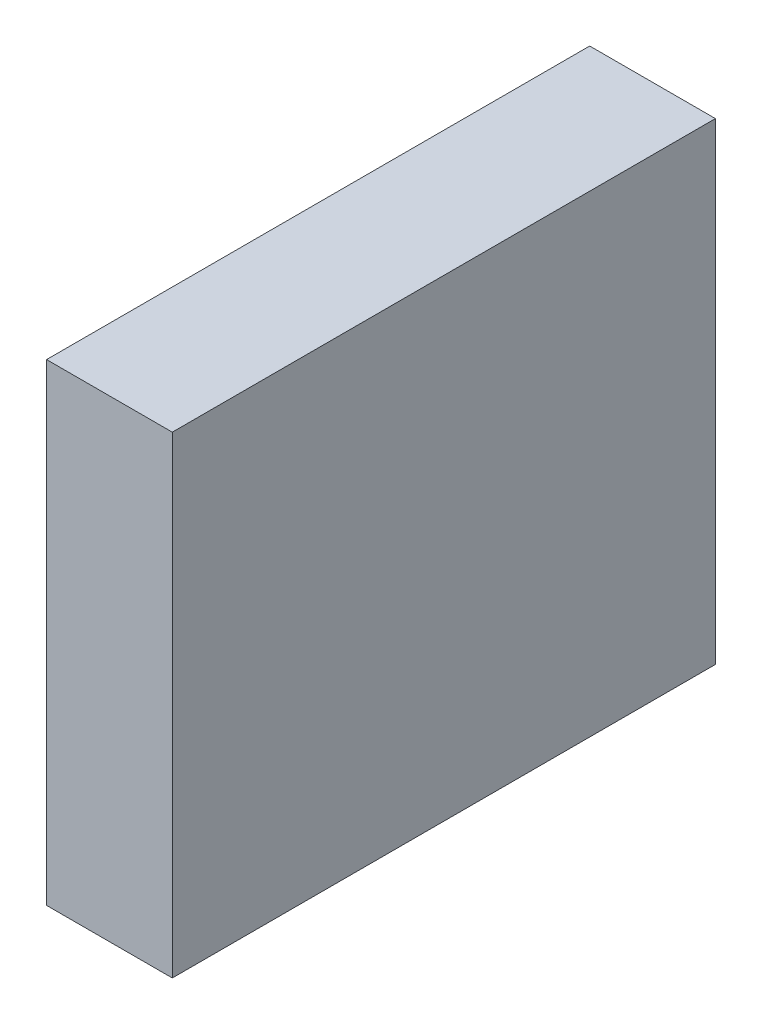
ISO-10303-21;
HEADER;
FILE_DESCRIPTION(('STEP AP214'),'2;1');
FILE_NAME('part.step','',(''),(''),'','','');
FILE_SCHEMA(('AUTOMOTIVE_DESIGN { 1 0 10303 214 1 1 1 1 }'));
ENDSEC;
DATA;
#1=APPLICATION_CONTEXT('core data for automotive mechanical design processes');
#2=APPLICATION_PROTOCOL_DEFINITION('international standard','automotive_design',2000,#1);
#3=PRODUCT_CONTEXT('',#1,'mechanical');
#4=PRODUCT('Part','Part','',(#3));
#5=PRODUCT_RELATED_PRODUCT_CATEGORY('part','',(#4));
#6=PRODUCT_DEFINITION_FORMATION('','',#4);
#7=PRODUCT_DEFINITION_CONTEXT('part definition',#1,'design');
#8=PRODUCT_DEFINITION('design','',#6,#7);
#9=PRODUCT_DEFINITION_SHAPE('','',#8);
#10=(LENGTH_UNIT() NAMED_UNIT(*) SI_UNIT(.MILLI.,.METRE.));
#11=(NAMED_UNIT(*) PLANE_ANGLE_UNIT() SI_UNIT($,.RADIAN.));
#12=(NAMED_UNIT(*) SI_UNIT($,.STERADIAN.) SOLID_ANGLE_UNIT());
#13=UNCERTAINTY_MEASURE_WITH_UNIT(LENGTH_MEASURE(1.E-05),#10,'distance_accuracy_value','');
#14=(GEOMETRIC_REPRESENTATION_CONTEXT(3) GLOBAL_UNCERTAINTY_ASSIGNED_CONTEXT((#13)) GLOBAL_UNIT_ASSIGNED_CONTEXT((#10,
#11,#12)) REPRESENTATION_CONTEXT('',''));
#15=CARTESIAN_POINT('',(0.,0.,0.));
#16=DIRECTION('',(0.,0.,1.));
#17=DIRECTION('',(1.,0.,0.));
#18=AXIS2_PLACEMENT_3D('',#15,#16,#17);
#19=CARTESIAN_POINT('',(0.,94.,108.));
#20=DIRECTION('',(1.,0.,0.));
#21=DIRECTION('',(0.,0.,-1.));
#22=AXIS2_PLACEMENT_3D('',#19,#20,#21);
#23=PLANE('',#22);
#24=DIRECTION('',(0.,-1.,0.));
#25=VECTOR('',#24,1.);
#26=CARTESIAN_POINT('',(0.,94.,0.));
#27=LINE('',#26,#25);
#28=CARTESIAN_POINT('',(0.,94.,0.));
#29=VERTEX_POINT('',#28);
#30=CARTESIAN_POINT('',(0.,0.,0.));
#31=VERTEX_POINT('',#30);
#32=EDGE_CURVE('E146',#29,#31,#27,.T.);
#33=ORIENTED_EDGE('',*,*,#32,.T.);
#34=DIRECTION('',(0.,0.,-1.));
#35=VECTOR('',#34,1.);
#36=CARTESIAN_POINT('',(0.,0.,108.));
#37=LINE('',#36,#35);
#38=CARTESIAN_POINT('',(0.,0.,108.));
#39=VERTEX_POINT('',#38);
#40=EDGE_CURVE('E137',#39,#31,#37,.T.);
#41=ORIENTED_EDGE('',*,*,#40,.F.);
#42=DIRECTION('',(0.,-1.,0.));
#43=VECTOR('',#42,1.);
#44=CARTESIAN_POINT('',(0.,94.,108.));
#45=LINE('',#44,#43);
#46=CARTESIAN_POINT('',(0.,94.,108.));
#47=VERTEX_POINT('',#46);
#48=EDGE_CURVE('E131',#47,#39,#45,.T.);
#49=ORIENTED_EDGE('',*,*,#48,.F.);
#50=DIRECTION('',(0.,0.,-1.));
#51=VECTOR('',#50,1.);
#52=CARTESIAN_POINT('',(0.,94.,108.));
#53=LINE('',#52,#51);
#54=EDGE_CURVE('E142',#47,#29,#53,.T.);
#55=ORIENTED_EDGE('',*,*,#54,.T.);
#56=EDGE_LOOP('',(#33,#41,#49,#55));
#57=FACE_BOUND('',#56,.T.);
#58=ADVANCED_FACE('F40',(#57),#23,.F.);
#59=CARTESIAN_POINT('',(0.,0.,108.));
#60=DIRECTION('',(0.,1.,0.));
#61=DIRECTION('',(0.,0.,1.));
#62=AXIS2_PLACEMENT_3D('',#59,#60,#61);
#63=PLANE('',#62);
#64=DIRECTION('',(1.,0.,0.));
#65=VECTOR('',#64,1.);
#66=CARTESIAN_POINT('',(0.,0.,0.));
#67=LINE('',#66,#65);
#68=CARTESIAN_POINT('',(25.,0.,0.));
#69=VERTEX_POINT('',#68);
#70=EDGE_CURVE('E136',#31,#69,#67,.T.);
#71=ORIENTED_EDGE('',*,*,#70,.T.);
#72=DIRECTION('',(0.,0.,-1.));
#73=VECTOR('',#72,1.);
#74=CARTESIAN_POINT('',(25.,0.,108.));
#75=LINE('',#74,#73);
#76=CARTESIAN_POINT('',(25.,0.,108.));
#77=VERTEX_POINT('',#76);
#78=EDGE_CURVE('E134',#77,#69,#75,.T.);
#79=ORIENTED_EDGE('',*,*,#78,.F.);
#80=DIRECTION('',(1.,0.,0.));
#81=VECTOR('',#80,1.);
#82=CARTESIAN_POINT('',(0.,0.,108.));
#83=LINE('',#82,#81);
#84=EDGE_CURVE('E126',#39,#77,#83,.T.);
#85=ORIENTED_EDGE('',*,*,#84,.F.);
#86=ORIENTED_EDGE('',*,*,#40,.T.);
#87=EDGE_LOOP('',(#71,#79,#85,#86));
#88=FACE_BOUND('',#87,.T.);
#89=ADVANCED_FACE('F135',(#88),#63,.F.);
#90=CARTESIAN_POINT('',(25.,0.,108.));
#91=DIRECTION('',(-1.,0.,0.));
#92=DIRECTION('',(0.,0.,1.));
#93=AXIS2_PLACEMENT_3D('',#90,#91,#92);
#94=PLANE('',#93);
#95=DIRECTION('',(0.,1.,0.));
#96=VECTOR('',#95,1.);
#97=CARTESIAN_POINT('',(25.,0.,0.));
#98=LINE('',#97,#96);
#99=CARTESIAN_POINT('',(25.,94.,0.));
#100=VERTEX_POINT('',#99);
#101=EDGE_CURVE('E112',#69,#100,#98,.T.);
#102=ORIENTED_EDGE('',*,*,#101,.T.);
#103=DIRECTION('',(0.,0.,-1.));
#104=VECTOR('',#103,1.);
#105=CARTESIAN_POINT('',(25.,94.,108.));
#106=LINE('',#105,#104);
#107=CARTESIAN_POINT('',(25.,94.,108.));
#108=VERTEX_POINT('',#107);
#109=EDGE_CURVE('E138',#108,#100,#106,.T.);
#110=ORIENTED_EDGE('',*,*,#109,.F.);
#111=DIRECTION('',(0.,1.,0.));
#112=VECTOR('',#111,1.);
#113=CARTESIAN_POINT('',(25.,0.,108.));
#114=LINE('',#113,#112);
#115=EDGE_CURVE('E129',#77,#108,#114,.T.);
#116=ORIENTED_EDGE('',*,*,#115,.F.);
#117=ORIENTED_EDGE('',*,*,#78,.T.);
#118=EDGE_LOOP('',(#102,#110,#116,#117));
#119=FACE_BOUND('',#118,.T.);
#120=ADVANCED_FACE('F140',(#119),#94,.F.);
#121=CARTESIAN_POINT('',(25.,94.,108.));
#122=DIRECTION('',(0.,-1.,0.));
#123=DIRECTION('',(0.,0.,-1.));
#124=AXIS2_PLACEMENT_3D('',#121,#122,#123);
#125=PLANE('',#124);
#126=DIRECTION('',(-1.,0.,0.));
#127=VECTOR('',#126,1.);
#128=CARTESIAN_POINT('',(25.,94.,0.));
#129=LINE('',#128,#127);
#130=EDGE_CURVE('E118',#100,#29,#129,.T.);
#131=ORIENTED_EDGE('',*,*,#130,.T.);
#132=ORIENTED_EDGE('',*,*,#54,.F.);
#133=DIRECTION('',(-1.,0.,0.));
#134=VECTOR('',#133,1.);
#135=CARTESIAN_POINT('',(25.,94.,108.));
#136=LINE('',#135,#134);
#137=EDGE_CURVE('E95',#108,#47,#136,.T.);
#138=ORIENTED_EDGE('',*,*,#137,.F.);
#139=ORIENTED_EDGE('',*,*,#109,.T.);
#140=EDGE_LOOP('',(#131,#132,#138,#139));
#141=FACE_BOUND('',#140,.T.);
#142=ADVANCED_FACE('F210',(#141),#125,.F.);
#143=CARTESIAN_POINT('',(0.,0.,108.));
#144=DIRECTION('',(0.,0.,1.));
#145=DIRECTION('',(1.,0.,0.));
#146=AXIS2_PLACEMENT_3D('',#143,#144,#145);
#147=PLANE('',#146);
#148=ORIENTED_EDGE('',*,*,#48,.T.);
#149=ORIENTED_EDGE('',*,*,#84,.T.);
#150=ORIENTED_EDGE('',*,*,#115,.T.);
#151=ORIENTED_EDGE('',*,*,#137,.T.);
#152=EDGE_LOOP('',(#148,#149,#150,#151));
#153=FACE_BOUND('',#152,.T.);
#154=ADVANCED_FACE('F127',(#153),#147,.T.);
#155=CARTESIAN_POINT('',(0.,0.,0.));
#156=DIRECTION('',(0.,0.,1.));
#157=DIRECTION('',(1.,0.,0.));
#158=AXIS2_PLACEMENT_3D('',#155,#156,#157);
#159=PLANE('',#158);
#160=ORIENTED_EDGE('',*,*,#32,.F.);
#161=ORIENTED_EDGE('',*,*,#130,.F.);
#162=ORIENTED_EDGE('',*,*,#101,.F.);
#163=ORIENTED_EDGE('',*,*,#70,.F.);
#164=EDGE_LOOP('',(#160,#161,#162,#163));
#165=FACE_BOUND('',#164,.T.);
#166=ADVANCED_FACE('F213',(#165),#159,.F.);
#167=CLOSED_SHELL('',(#58,#89,#120,#142,#154,#166));
#168=CARTESIAN_POINT('',(4.,94.,108.));
#169=DIRECTION('',(1.,0.,0.));
#170=DIRECTION('',(0.,0.,-1.));
#171=AXIS2_PLACEMENT_3D('',#168,#169,#170);
#172=PLANE('',#171);
#173=DIRECTION('',(0.,-1.,0.));
#174=VECTOR('',#173,1.);
#175=CARTESIAN_POINT('',(4.,94.,4.));
#176=LINE('',#175,#174);
#177=CARTESIAN_POINT('',(4.,90.,4.));
#178=VERTEX_POINT('',#177);
#179=CARTESIAN_POINT('',(4.,4.,4.));
#180=VERTEX_POINT('',#179);
#181=EDGE_CURVE('E44',#178,#180,#176,.T.);
#182=ORIENTED_EDGE('',*,*,#181,.F.);
#183=DIRECTION('',(0.,0.,-1.));
#184=VECTOR('',#183,1.);
#185=CARTESIAN_POINT('',(4.,90.,108.));
#186=LINE('',#185,#184);
#187=CARTESIAN_POINT('',(4.,90.,104.));
#188=VERTEX_POINT('',#187);
#189=EDGE_CURVE('E170',#188,#178,#186,.T.);
#190=ORIENTED_EDGE('',*,*,#189,.F.);
#191=DIRECTION('',(0.,-1.,0.));
#192=VECTOR('',#191,1.);
#193=CARTESIAN_POINT('',(4.,94.,104.));
#194=LINE('',#193,#192);
#195=CARTESIAN_POINT('',(4.,4.,104.));
#196=VERTEX_POINT('',#195);
#197=EDGE_CURVE('E157',#188,#196,#194,.T.);
#198=ORIENTED_EDGE('',*,*,#197,.T.);
#199=DIRECTION('',(0.,0.,-1.));
#200=VECTOR('',#199,1.);
#201=CARTESIAN_POINT('',(4.,4.,108.));
#202=LINE('',#201,#200);
#203=EDGE_CURVE('E168',#196,#180,#202,.T.);
#204=ORIENTED_EDGE('',*,*,#203,.T.);
#205=EDGE_LOOP('',(#182,#190,#198,#204));
#206=FACE_BOUND('',#205,.T.);
#207=ADVANCED_FACE('F177',(#206),#172,.T.);
#208=CARTESIAN_POINT('',(0.,4.,108.));
#209=DIRECTION('',(0.,1.,0.));
#210=DIRECTION('',(0.,0.,1.));
#211=AXIS2_PLACEMENT_3D('',#208,#209,#210);
#212=PLANE('',#211);
#213=DIRECTION('',(1.,0.,0.));
#214=VECTOR('',#213,1.);
#215=CARTESIAN_POINT('',(0.,4.,4.));
#216=LINE('',#215,#214);
#217=CARTESIAN_POINT('',(21.,4.,4.));
#218=VERTEX_POINT('',#217);
#219=EDGE_CURVE('E60',#180,#218,#216,.T.);
#220=ORIENTED_EDGE('',*,*,#219,.F.);
#221=ORIENTED_EDGE('',*,*,#203,.F.);
#222=DIRECTION('',(1.,0.,0.));
#223=VECTOR('',#222,1.);
#224=CARTESIAN_POINT('',(0.,4.,104.));
#225=LINE('',#224,#223);
#226=CARTESIAN_POINT('',(21.,4.,104.));
#227=VERTEX_POINT('',#226);
#228=EDGE_CURVE('E83',#196,#227,#225,.T.);
#229=ORIENTED_EDGE('',*,*,#228,.T.);
#230=DIRECTION('',(0.,0.,-1.));
#231=VECTOR('',#230,1.);
#232=CARTESIAN_POINT('',(21.,4.,108.));
#233=LINE('',#232,#231);
#234=EDGE_CURVE('E164',#227,#218,#233,.T.);
#235=ORIENTED_EDGE('',*,*,#234,.T.);
#236=EDGE_LOOP('',(#220,#221,#229,#235));
#237=FACE_BOUND('',#236,.T.);
#238=ADVANCED_FACE('F178',(#237),#212,.T.);
#239=CARTESIAN_POINT('',(21.,0.,108.));
#240=DIRECTION('',(-1.,0.,0.));
#241=DIRECTION('',(0.,0.,1.));
#242=AXIS2_PLACEMENT_3D('',#239,#240,#241);
#243=PLANE('',#242);
#244=DIRECTION('',(0.,1.,0.));
#245=VECTOR('',#244,1.);
#246=CARTESIAN_POINT('',(21.,0.,4.));
#247=LINE('',#246,#245);
#248=CARTESIAN_POINT('',(21.,90.,4.));
#249=VERTEX_POINT('',#248);
#250=EDGE_CURVE('E166',#218,#249,#247,.T.);
#251=ORIENTED_EDGE('',*,*,#250,.F.);
#252=ORIENTED_EDGE('',*,*,#234,.F.);
#253=DIRECTION('',(0.,1.,0.));
#254=VECTOR('',#253,1.);
#255=CARTESIAN_POINT('',(21.,0.,104.));
#256=LINE('',#255,#254);
#257=CARTESIAN_POINT('',(21.,90.,104.));
#258=VERTEX_POINT('',#257);
#259=EDGE_CURVE('E51',#227,#258,#256,.T.);
#260=ORIENTED_EDGE('',*,*,#259,.T.);
#261=DIRECTION('',(0.,0.,-1.));
#262=VECTOR('',#261,1.);
#263=CARTESIAN_POINT('',(21.,90.,108.));
#264=LINE('',#263,#262);
#265=EDGE_CURVE('E159',#258,#249,#264,.T.);
#266=ORIENTED_EDGE('',*,*,#265,.T.);
#267=EDGE_LOOP('',(#251,#252,#260,#266));
#268=FACE_BOUND('',#267,.T.);
#269=ADVANCED_FACE('F182',(#268),#243,.T.);
#270=CARTESIAN_POINT('',(25.,90.,108.));
#271=DIRECTION('',(0.,-1.,0.));
#272=DIRECTION('',(0.,0.,-1.));
#273=AXIS2_PLACEMENT_3D('',#270,#271,#272);
#274=PLANE('',#273);
#275=DIRECTION('',(-1.,0.,0.));
#276=VECTOR('',#275,1.);
#277=CARTESIAN_POINT('',(25.,90.,4.));
#278=LINE('',#277,#276);
#279=EDGE_CURVE('E162',#249,#178,#278,.T.);
#280=ORIENTED_EDGE('',*,*,#279,.F.);
#281=ORIENTED_EDGE('',*,*,#265,.F.);
#282=DIRECTION('',(-1.,0.,0.));
#283=VECTOR('',#282,1.);
#284=CARTESIAN_POINT('',(25.,90.,104.));
#285=LINE('',#284,#283);
#286=EDGE_CURVE('E11',#258,#188,#285,.T.);
#287=ORIENTED_EDGE('',*,*,#286,.T.);
#288=ORIENTED_EDGE('',*,*,#189,.T.);
#289=EDGE_LOOP('',(#280,#281,#287,#288));
#290=FACE_BOUND('',#289,.T.);
#291=ADVANCED_FACE('F186',(#290),#274,.T.);
#292=CARTESIAN_POINT('',(0.,0.,104.));
#293=DIRECTION('',(0.,0.,1.));
#294=DIRECTION('',(1.,0.,0.));
#295=AXIS2_PLACEMENT_3D('',#292,#293,#294);
#296=PLANE('',#295);
#297=ORIENTED_EDGE('',*,*,#197,.F.);
#298=ORIENTED_EDGE('',*,*,#286,.F.);
#299=ORIENTED_EDGE('',*,*,#259,.F.);
#300=ORIENTED_EDGE('',*,*,#228,.F.);
#301=EDGE_LOOP('',(#297,#298,#299,#300));
#302=FACE_BOUND('',#301,.T.);
#303=ADVANCED_FACE('F185',(#302),#296,.F.);
#304=CARTESIAN_POINT('',(0.,0.,4.));
#305=DIRECTION('',(0.,0.,1.));
#306=DIRECTION('',(1.,0.,0.));
#307=AXIS2_PLACEMENT_3D('',#304,#305,#306);
#308=PLANE('',#307);
#309=ORIENTED_EDGE('',*,*,#181,.T.);
#310=ORIENTED_EDGE('',*,*,#219,.T.);
#311=ORIENTED_EDGE('',*,*,#250,.T.);
#312=ORIENTED_EDGE('',*,*,#279,.T.);
#313=EDGE_LOOP('',(#309,#310,#311,#312));
#314=FACE_BOUND('',#313,.T.);
#315=ADVANCED_FACE('F42',(#314),#308,.T.);
#316=CLOSED_SHELL('',(#207,#238,#269,#291,#303,#315));
#317=ORIENTED_CLOSED_SHELL('',*,#316,.T.);
#318=BREP_WITH_VOIDS('B2',#167,(#317));
#319=ADVANCED_BREP_SHAPE_REPRESENTATION('',(#18,#318),#14);
#320=SHAPE_DEFINITION_REPRESENTATION(#9,#319);
ENDSEC;
END-ISO-10303-21;
